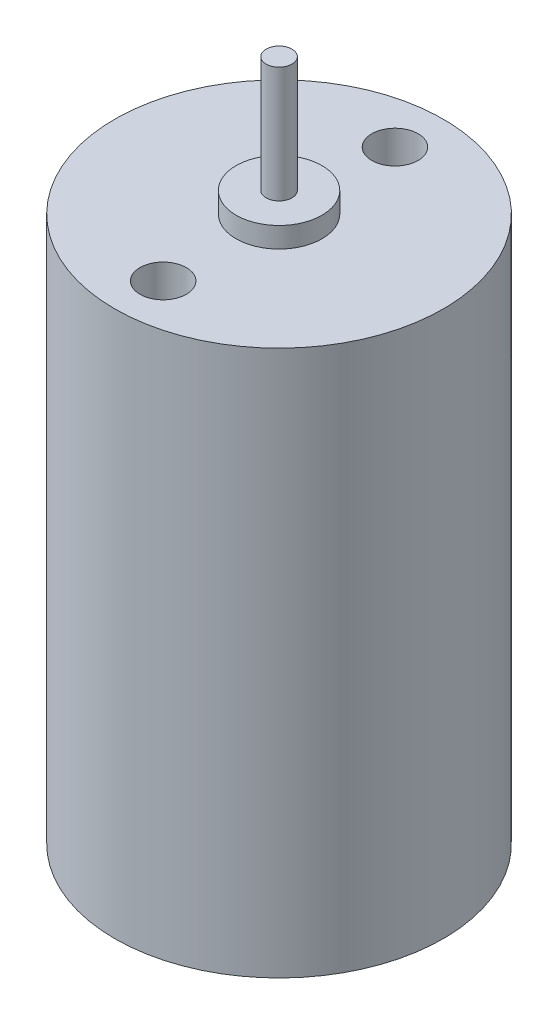
ISO-10303-21;
HEADER;
FILE_DESCRIPTION(('STEP AP214'),'2;1');
FILE_NAME('part.step','',(''),(''),'','','');
FILE_SCHEMA(('AUTOMOTIVE_DESIGN { 1 0 10303 214 1 1 1 1 }'));
ENDSEC;
DATA;
#1=APPLICATION_CONTEXT('core data for automotive mechanical design processes');
#2=APPLICATION_PROTOCOL_DEFINITION('international standard','automotive_design',2000,#1);
#3=PRODUCT_CONTEXT('',#1,'mechanical');
#4=PRODUCT('Part','Part','',(#3));
#5=PRODUCT_RELATED_PRODUCT_CATEGORY('part','',(#4));
#6=PRODUCT_DEFINITION_FORMATION('','',#4);
#7=PRODUCT_DEFINITION_CONTEXT('part definition',#1,'design');
#8=PRODUCT_DEFINITION('design','',#6,#7);
#9=PRODUCT_DEFINITION_SHAPE('','',#8);
#10=(LENGTH_UNIT() NAMED_UNIT(*) SI_UNIT(.MILLI.,.METRE.));
#11=(NAMED_UNIT(*) PLANE_ANGLE_UNIT() SI_UNIT($,.RADIAN.));
#12=(NAMED_UNIT(*) SI_UNIT($,.STERADIAN.) SOLID_ANGLE_UNIT());
#13=UNCERTAINTY_MEASURE_WITH_UNIT(LENGTH_MEASURE(1.E-05),#10,'distance_accuracy_value','');
#14=(GEOMETRIC_REPRESENTATION_CONTEXT(3) GLOBAL_UNCERTAINTY_ASSIGNED_CONTEXT((#13)) GLOBAL_UNIT_ASSIGNED_CONTEXT((#10,
#11,#12)) REPRESENTATION_CONTEXT('',''));
#15=CARTESIAN_POINT('',(0.,0.,0.));
#16=DIRECTION('',(0.,0.,1.));
#17=DIRECTION('',(1.,0.,0.));
#18=AXIS2_PLACEMENT_3D('',#15,#16,#17);
#19=CARTESIAN_POINT('',(0.,40.,0.));
#20=DIRECTION('',(0.,-1.,0.));
#21=DIRECTION('',(0.,0.,-1.));
#22=AXIS2_PLACEMENT_3D('',#19,#20,#21);
#23=CYLINDRICAL_SURFACE('',#22,12.05);
#24=CARTESIAN_POINT('',(0.,40.,0.));
#25=DIRECTION('',(0.,1.,0.));
#26=DIRECTION('',(0.,0.,1.));
#27=AXIS2_PLACEMENT_3D('',#24,#25,#26);
#28=CIRCLE('',#27,12.05);
#29=CARTESIAN_POINT('',(0.,40.,12.05));
#30=VERTEX_POINT('',#29);
#31=EDGE_CURVE('E47',#30,#30,#28,.T.);
#32=ORIENTED_EDGE('',*,*,#31,.F.);
#33=EDGE_LOOP('',(#32));
#34=FACE_BOUND('',#33,.T.);
#35=CARTESIAN_POINT('',(0.,0.,0.));
#36=DIRECTION('',(0.,1.,0.));
#37=DIRECTION('',(0.,0.,1.));
#38=AXIS2_PLACEMENT_3D('',#35,#36,#37);
#39=CIRCLE('',#38,12.05);
#40=CARTESIAN_POINT('',(0.,0.,12.05));
#41=VERTEX_POINT('',#40);
#42=EDGE_CURVE('E38',#41,#41,#39,.T.);
#43=ORIENTED_EDGE('',*,*,#42,.T.);
#44=EDGE_LOOP('',(#43));
#45=FACE_BOUND('',#44,.T.);
#46=ADVANCED_FACE('F35',(#34,#45),#23,.T.);
#47=CARTESIAN_POINT('',(0.,40.,0.));
#48=DIRECTION('',(0.,1.,0.));
#49=DIRECTION('',(0.,0.,1.));
#50=AXIS2_PLACEMENT_3D('',#47,#48,#49);
#51=PLANE('',#50);
#52=CARTESIAN_POINT('',(0.,40.,-8.5));
#53=DIRECTION('',(0.,1.,0.));
#54=DIRECTION('',(0.,0.,1.));
#55=AXIS2_PLACEMENT_3D('',#52,#53,#54);
#56=CIRCLE('',#55,1.7);
#57=CARTESIAN_POINT('',(0.,40.,-6.8));
#58=VERTEX_POINT('',#57);
#59=EDGE_CURVE('E175',#58,#58,#56,.T.);
#60=ORIENTED_EDGE('',*,*,#59,.F.);
#61=EDGE_LOOP('',(#60));
#62=FACE_BOUND('',#61,.T.);
#63=CARTESIAN_POINT('',(0.,40.,8.5));
#64=DIRECTION('',(0.,1.,0.));
#65=DIRECTION('',(0.,0.,1.));
#66=AXIS2_PLACEMENT_3D('',#63,#64,#65);
#67=CIRCLE('',#66,1.7);
#68=CARTESIAN_POINT('',(0.,40.,10.2));
#69=VERTEX_POINT('',#68);
#70=EDGE_CURVE('E183',#69,#69,#67,.T.);
#71=ORIENTED_EDGE('',*,*,#70,.F.);
#72=EDGE_LOOP('',(#71));
#73=FACE_BOUND('',#72,.T.);
#74=CARTESIAN_POINT('',(0.,40.,0.));
#75=DIRECTION('',(0.,1.,0.));
#76=DIRECTION('',(0.,0.,1.));
#77=AXIS2_PLACEMENT_3D('',#74,#75,#76);
#78=CIRCLE('',#77,3.15);
#79=CARTESIAN_POINT('',(0.,40.,3.15));
#80=VERTEX_POINT('',#79);
#81=EDGE_CURVE('E42',#80,#80,#78,.T.);
#82=ORIENTED_EDGE('',*,*,#81,.F.);
#83=EDGE_LOOP('',(#82));
#84=FACE_BOUND('',#83,.T.);
#85=ORIENTED_EDGE('',*,*,#31,.T.);
#86=EDGE_LOOP('',(#85));
#87=FACE_BOUND('',#86,.T.);
#88=ADVANCED_FACE('F65',(#62,#73,#84,#87),#51,.T.);
#89=CARTESIAN_POINT('',(0.,0.,0.));
#90=DIRECTION('',(0.,1.,0.));
#91=DIRECTION('',(0.,0.,1.));
#92=AXIS2_PLACEMENT_3D('',#89,#90,#91);
#93=PLANE('',#92);
#94=ORIENTED_EDGE('',*,*,#42,.F.);
#95=EDGE_LOOP('',(#94));
#96=FACE_BOUND('',#95,.T.);
#97=ADVANCED_FACE('F62',(#96),#93,.F.);
#98=CARTESIAN_POINT('',(0.,41.5,0.));
#99=DIRECTION('',(0.,-1.,0.));
#100=DIRECTION('',(0.,0.,-1.));
#101=AXIS2_PLACEMENT_3D('',#98,#99,#100);
#102=CYLINDRICAL_SURFACE('',#101,3.15);
#103=CARTESIAN_POINT('',(0.,41.5,0.));
#104=DIRECTION('',(0.,1.,0.));
#105=DIRECTION('',(0.,0.,1.));
#106=AXIS2_PLACEMENT_3D('',#103,#104,#105);
#107=CIRCLE('',#106,3.15);
#108=CARTESIAN_POINT('',(0.,41.5,3.15));
#109=VERTEX_POINT('',#108);
#110=EDGE_CURVE('E53',#109,#109,#107,.T.);
#111=ORIENTED_EDGE('',*,*,#110,.F.);
#112=EDGE_LOOP('',(#111));
#113=FACE_BOUND('',#112,.T.);
#114=ORIENTED_EDGE('',*,*,#81,.T.);
#115=EDGE_LOOP('',(#114));
#116=FACE_BOUND('',#115,.T.);
#117=ADVANCED_FACE('F64',(#113,#116),#102,.T.);
#118=CARTESIAN_POINT('',(0.,41.5,0.));
#119=DIRECTION('',(0.,1.,0.));
#120=DIRECTION('',(0.,0.,1.));
#121=AXIS2_PLACEMENT_3D('',#118,#119,#120);
#122=PLANE('',#121);
#123=CARTESIAN_POINT('',(0.,41.5,0.));
#124=DIRECTION('',(0.,1.,0.));
#125=DIRECTION('',(0.,0.,1.));
#126=AXIS2_PLACEMENT_3D('',#123,#124,#125);
#127=CIRCLE('',#126,0.95);
#128=CARTESIAN_POINT('',(0.,41.5,0.95));
#129=VERTEX_POINT('',#128);
#130=EDGE_CURVE('E10',#129,#129,#127,.T.);
#131=ORIENTED_EDGE('',*,*,#130,.F.);
#132=EDGE_LOOP('',(#131));
#133=FACE_BOUND('',#132,.T.);
#134=ORIENTED_EDGE('',*,*,#110,.T.);
#135=EDGE_LOOP('',(#134));
#136=FACE_BOUND('',#135,.T.);
#137=ADVANCED_FACE('F70',(#133,#136),#122,.T.);
#138=CARTESIAN_POINT('',(0.,50.,0.));
#139=DIRECTION('',(0.,-1.,0.));
#140=DIRECTION('',(0.,0.,-1.));
#141=AXIS2_PLACEMENT_3D('',#138,#139,#140);
#142=CYLINDRICAL_SURFACE('',#141,0.95);
#143=CARTESIAN_POINT('',(0.,50.,0.));
#144=DIRECTION('',(0.,1.,0.));
#145=DIRECTION('',(0.,0.,1.));
#146=AXIS2_PLACEMENT_3D('',#143,#144,#145);
#147=CIRCLE('',#146,0.95);
#148=CARTESIAN_POINT('',(0.,50.,0.95));
#149=VERTEX_POINT('',#148);
#150=EDGE_CURVE('E51',#149,#149,#147,.T.);
#151=ORIENTED_EDGE('',*,*,#150,.F.);
#152=EDGE_LOOP('',(#151));
#153=FACE_BOUND('',#152,.T.);
#154=ORIENTED_EDGE('',*,*,#130,.T.);
#155=EDGE_LOOP('',(#154));
#156=FACE_BOUND('',#155,.T.);
#157=ADVANCED_FACE('F137',(#153,#156),#142,.T.);
#158=CARTESIAN_POINT('',(0.,50.,0.));
#159=DIRECTION('',(0.,1.,0.));
#160=DIRECTION('',(0.,0.,1.));
#161=AXIS2_PLACEMENT_3D('',#158,#159,#160);
#162=PLANE('',#161);
#163=ORIENTED_EDGE('',*,*,#150,.T.);
#164=EDGE_LOOP('',(#163));
#165=FACE_BOUND('',#164,.T.);
#166=ADVANCED_FACE('F90',(#165),#162,.T.);
#167=CARTESIAN_POINT('',(0.,35.,8.5));
#168=DIRECTION('',(0.,1.,0.));
#169=DIRECTION('',(0.,0.,1.));
#170=AXIS2_PLACEMENT_3D('',#167,#168,#169);
#171=CYLINDRICAL_SURFACE('',#170,1.7);
#172=CARTESIAN_POINT('',(0.,35.,8.5));
#173=DIRECTION('',(0.,1.,0.));
#174=DIRECTION('',(0.,0.,1.));
#175=AXIS2_PLACEMENT_3D('',#172,#173,#174);
#176=CIRCLE('',#175,1.7);
#177=CARTESIAN_POINT('',(0.,35.,10.2));
#178=VERTEX_POINT('',#177);
#179=EDGE_CURVE('E179',#178,#178,#176,.T.);
#180=ORIENTED_EDGE('',*,*,#179,.F.);
#181=EDGE_LOOP('',(#180));
#182=FACE_BOUND('',#181,.T.);
#183=ORIENTED_EDGE('',*,*,#70,.T.);
#184=EDGE_LOOP('',(#183));
#185=FACE_BOUND('',#184,.T.);
#186=ADVANCED_FACE('F95',(#182,#185),#171,.F.);
#187=CARTESIAN_POINT('',(0.,35.,8.5));
#188=DIRECTION('',(0.,1.,0.));
#189=DIRECTION('',(0.,0.,1.));
#190=AXIS2_PLACEMENT_3D('',#187,#188,#189);
#191=PLANE('',#190);
#192=ORIENTED_EDGE('',*,*,#179,.T.);
#193=EDGE_LOOP('',(#192));
#194=FACE_BOUND('',#193,.T.);
#195=ADVANCED_FACE('F100',(#194),#191,.T.);
#196=CARTESIAN_POINT('',(0.,35.,-8.5));
#197=DIRECTION('',(0.,1.,0.));
#198=DIRECTION('',(0.,0.,1.));
#199=AXIS2_PLACEMENT_3D('',#196,#197,#198);
#200=CYLINDRICAL_SURFACE('',#199,1.7);
#201=CARTESIAN_POINT('',(0.,35.,-8.5));
#202=DIRECTION('',(0.,1.,0.));
#203=DIRECTION('',(0.,0.,1.));
#204=AXIS2_PLACEMENT_3D('',#201,#202,#203);
#205=CIRCLE('',#204,1.7);
#206=CARTESIAN_POINT('',(0.,35.,-6.8));
#207=VERTEX_POINT('',#206);
#208=EDGE_CURVE('E174',#207,#207,#205,.T.);
#209=ORIENTED_EDGE('',*,*,#208,.F.);
#210=EDGE_LOOP('',(#209));
#211=FACE_BOUND('',#210,.T.);
#212=ORIENTED_EDGE('',*,*,#59,.T.);
#213=EDGE_LOOP('',(#212));
#214=FACE_BOUND('',#213,.T.);
#215=ADVANCED_FACE('F110',(#211,#214),#200,.F.);
#216=CARTESIAN_POINT('',(0.,35.,-8.5));
#217=DIRECTION('',(0.,1.,0.));
#218=DIRECTION('',(0.,0.,1.));
#219=AXIS2_PLACEMENT_3D('',#216,#217,#218);
#220=PLANE('',#219);
#221=ORIENTED_EDGE('',*,*,#208,.T.);
#222=EDGE_LOOP('',(#221));
#223=FACE_BOUND('',#222,.T.);
#224=ADVANCED_FACE('F120',(#223),#220,.T.);
#225=CLOSED_SHELL('',(#46,#88,#97,#117,#137,#157,#166,#186,#195,#215,#224));
#226=MANIFOLD_SOLID_BREP('B2',#225);
#227=ADVANCED_BREP_SHAPE_REPRESENTATION('',(#18,#226),#14);
#228=SHAPE_DEFINITION_REPRESENTATION(#9,#227);
ENDSEC;
END-ISO-10303-21;
